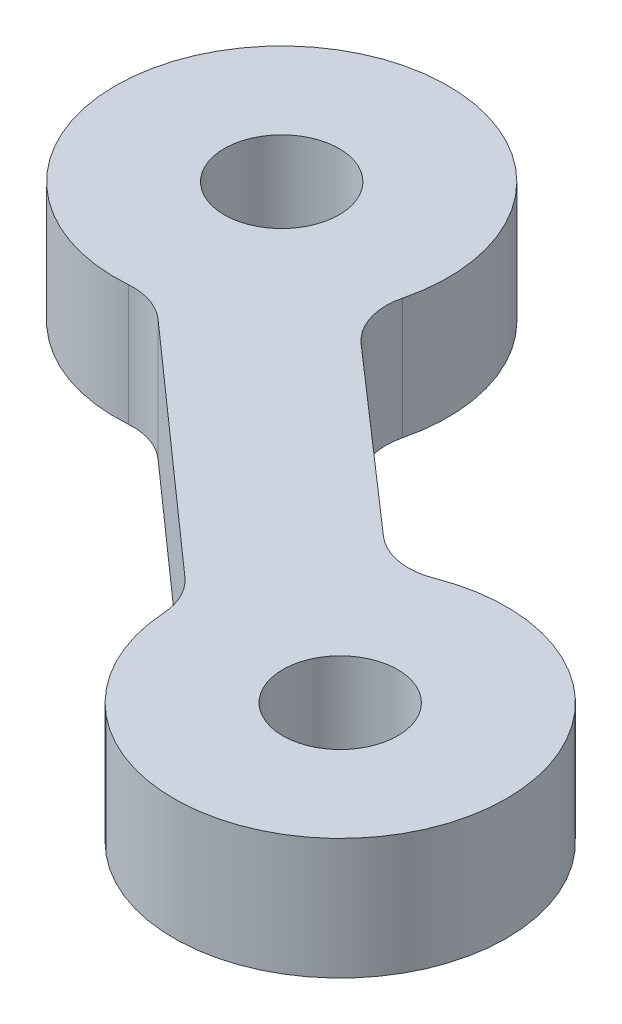
ISO-10303-21;
HEADER;
FILE_DESCRIPTION(('STEP AP214'),'2;1');
FILE_NAME('part.step','',(''),(''),'','','');
FILE_SCHEMA(('AUTOMOTIVE_DESIGN { 1 0 10303 214 1 1 1 1 }'));
ENDSEC;
DATA;
#1=APPLICATION_CONTEXT('core data for automotive mechanical design processes');
#2=APPLICATION_PROTOCOL_DEFINITION('international standard','automotive_design',2000,#1);
#3=PRODUCT_CONTEXT('',#1,'mechanical');
#4=PRODUCT('Part','Part','',(#3));
#5=PRODUCT_RELATED_PRODUCT_CATEGORY('part','',(#4));
#6=PRODUCT_DEFINITION_FORMATION('','',#4);
#7=PRODUCT_DEFINITION_CONTEXT('part definition',#1,'design');
#8=PRODUCT_DEFINITION('design','',#6,#7);
#9=PRODUCT_DEFINITION_SHAPE('','',#8);
#10=(LENGTH_UNIT() NAMED_UNIT(*) SI_UNIT(.MILLI.,.METRE.));
#11=(NAMED_UNIT(*) PLANE_ANGLE_UNIT() SI_UNIT($,.RADIAN.));
#12=(NAMED_UNIT(*) SI_UNIT($,.STERADIAN.) SOLID_ANGLE_UNIT());
#13=UNCERTAINTY_MEASURE_WITH_UNIT(LENGTH_MEASURE(1.E-05),#10,'distance_accuracy_value','');
#14=(GEOMETRIC_REPRESENTATION_CONTEXT(3) GLOBAL_UNCERTAINTY_ASSIGNED_CONTEXT((#13)) GLOBAL_UNIT_ASSIGNED_CONTEXT((#10,
#11,#12)) REPRESENTATION_CONTEXT('',''));
#15=CARTESIAN_POINT('',(0.,0.,0.));
#16=DIRECTION('',(0.,0.,1.));
#17=DIRECTION('',(1.,0.,0.));
#18=AXIS2_PLACEMENT_3D('',#15,#16,#17);
#19=CARTESIAN_POINT('',(57.5957148987973,4.,-64.957573194132));
#20=DIRECTION('',(-0.66343448312114,0.,0.748234379459929));
#21=DIRECTION('',(0.748234379459929,0.,0.66343448312114));
#22=AXIS2_PLACEMENT_3D('',#19,#20,#21);
#23=PLANE('',#22);
#24=DIRECTION('',(-0.748234379459929,0.,-0.66343448312114));
#25=VECTOR('',#24,1.);
#26=CARTESIAN_POINT('',(57.5957148987973,4.,-64.957573194132));
#27=LINE('',#26,#25);
#28=CARTESIAN_POINT('',(91.8288464106831,4.,-34.6041965869265));
#29=VERTEX_POINT('',#28);
#30=CARTESIAN_POINT('',(83.9878087778209,4.,-41.5565832880643));
#31=VERTEX_POINT('',#30);
#32=EDGE_CURVE('E168',#29,#31,#27,.T.);
#33=ORIENTED_EDGE('',*,*,#32,.T.);
#34=DIRECTION('',(0.,-1.,0.));
#35=VECTOR('',#34,1.);
#36=CARTESIAN_POINT('',(83.9878087778209,4.,-41.5565832880643));
#37=LINE('',#36,#35);
#38=CARTESIAN_POINT('',(83.9878087778209,0.,-41.5565832880643));
#39=VERTEX_POINT('',#38);
#40=EDGE_CURVE('E120',#31,#39,#37,.T.);
#41=ORIENTED_EDGE('',*,*,#40,.T.);
#42=DIRECTION('',(-0.748234379459929,0.,-0.66343448312114));
#43=VECTOR('',#42,1.);
#44=CARTESIAN_POINT('',(57.5957148987973,0.,-64.957573194132));
#45=LINE('',#44,#43);
#46=CARTESIAN_POINT('',(91.8288464106831,0.,-34.6041965869265));
#47=VERTEX_POINT('',#46);
#48=EDGE_CURVE('E104',#47,#39,#45,.T.);
#49=ORIENTED_EDGE('',*,*,#48,.F.);
#50=DIRECTION('',(0.,-1.,0.));
#51=VECTOR('',#50,1.);
#52=CARTESIAN_POINT('',(91.828846410683,4.,-34.6041965869265));
#53=LINE('',#52,#51);
#54=EDGE_CURVE('E117',#47,#29,#53,.F.);
#55=ORIENTED_EDGE('',*,*,#54,.T.);
#56=EDGE_LOOP('',(#33,#41,#49,#55));
#57=FACE_BOUND('',#56,.T.);
#58=ADVANCED_FACE('F36',(#57),#23,.T.);
#59=CARTESIAN_POINT('',(97.9868806190565,4.,-33.5833584269257));
#60=DIRECTION('',(0.,-1.,0.));
#61=DIRECTION('',(0.,0.,-1.));
#62=AXIS2_PLACEMENT_3D('',#59,#60,#61);
#63=CYLINDRICAL_SURFACE('',#62,5.5);
#64=CARTESIAN_POINT('',(97.9868806190565,4.,-33.5833584269257));
#65=DIRECTION('',(0.,1.,0.));
#66=DIRECTION('',(0.,0.,1.));
#67=AXIS2_PLACEMENT_3D('',#64,#65,#66);
#68=CIRCLE('',#67,5.5);
#69=CARTESIAN_POINT('',(92.4979516243383,4.,-33.2345626543851));
#70=VERTEX_POINT('',#69);
#71=CARTESIAN_POINT('',(95.9828217037036,4.,-38.7052475182468));
#72=VERTEX_POINT('',#71);
#73=EDGE_CURVE('E166',#70,#72,#68,.T.);
#74=ORIENTED_EDGE('',*,*,#73,.F.);
#75=DIRECTION('',(0.,-1.,0.));
#76=VECTOR('',#75,1.);
#77=CARTESIAN_POINT('',(92.4979516243383,4.,-33.2345626543851));
#78=LINE('',#77,#76);
#79=CARTESIAN_POINT('',(92.4979516243383,0.,-33.2345626543851));
#80=VERTEX_POINT('',#79);
#81=EDGE_CURVE('E142',#70,#80,#78,.T.);
#82=ORIENTED_EDGE('',*,*,#81,.T.);
#83=CARTESIAN_POINT('',(97.9868806190565,0.,-33.5833584269257));
#84=DIRECTION('',(0.,1.,0.));
#85=DIRECTION('',(0.,0.,1.));
#86=AXIS2_PLACEMENT_3D('',#83,#84,#85);
#87=CIRCLE('',#86,5.5);
#88=CARTESIAN_POINT('',(95.9828217037036,0.,-38.7052475182468));
#89=VERTEX_POINT('',#88);
#90=EDGE_CURVE('E106',#80,#89,#87,.T.);
#91=ORIENTED_EDGE('',*,*,#90,.T.);
#92=DIRECTION('',(0.,-1.,0.));
#93=VECTOR('',#92,1.);
#94=CARTESIAN_POINT('',(95.9828217037036,4.,-38.7052475182468));
#95=LINE('',#94,#93);
#96=EDGE_CURVE('E140',#89,#72,#95,.F.);
#97=ORIENTED_EDGE('',*,*,#96,.T.);
#98=EDGE_LOOP('',(#74,#82,#91,#97));
#99=FACE_BOUND('',#98,.T.);
#100=ADVANCED_FACE('F162',(#99),#63,.T.);
#101=CARTESIAN_POINT('',(60.0649297277624,4.,-68.6841124689655));
#102=DIRECTION('',(-0.658295591456619,0.,0.752759532831555));
#103=DIRECTION('',(0.752759532831555,0.,0.658295591456619));
#104=AXIS2_PLACEMENT_3D('',#101,#102,#103);
#105=PLANE('',#104);
#106=DIRECTION('',(-0.752759532831555,0.,-0.658295591456619));
#107=VECTOR('',#106,1.);
#108=CARTESIAN_POINT('',(60.0649297277624,0.,-68.6841124689655));
#109=LINE('',#108,#107);
#110=CARTESIAN_POINT('',(93.9374818242984,0.,-39.0622335767005));
#111=VERTEX_POINT('',#110);
#112=CARTESIAN_POINT('',(88.0534392912902,0.,-44.2078864585077));
#113=VERTEX_POINT('',#112);
#114=EDGE_CURVE('E156',#111,#113,#109,.T.);
#115=ORIENTED_EDGE('',*,*,#114,.T.);
#116=DIRECTION('',(0.,1.,0.));
#117=VECTOR('',#116,1.);
#118=CARTESIAN_POINT('',(88.0534392912902,4.,-44.2078864585077));
#119=LINE('',#118,#117);
#120=CARTESIAN_POINT('',(88.0534392912902,4.,-44.2078864585077));
#121=VERTEX_POINT('',#120);
#122=EDGE_CURVE('E51',#113,#121,#119,.T.);
#123=ORIENTED_EDGE('',*,*,#122,.T.);
#124=DIRECTION('',(-0.752759532831555,0.,-0.658295591456619));
#125=VECTOR('',#124,1.);
#126=CARTESIAN_POINT('',(60.0649297277624,4.,-68.6841124689655));
#127=LINE('',#126,#125);
#128=CARTESIAN_POINT('',(93.9374818242984,4.,-39.0622335767005));
#129=VERTEX_POINT('',#128);
#130=EDGE_CURVE('E130',#129,#121,#127,.T.);
#131=ORIENTED_EDGE('',*,*,#130,.F.);
#132=DIRECTION('',(0.,1.,0.));
#133=VECTOR('',#132,1.);
#134=CARTESIAN_POINT('',(93.9374818242984,0.,-39.0622335767005));
#135=LINE('',#134,#133);
#136=EDGE_CURVE('E144',#129,#111,#135,.F.);
#137=ORIENTED_EDGE('',*,*,#136,.T.);
#138=EDGE_LOOP('',(#115,#123,#131,#137));
#139=FACE_BOUND('',#138,.T.);
#140=ADVANCED_FACE('F164',(#139),#105,.F.);
#141=CARTESIAN_POINT('',(82.0955523148534,4.,-47.5387732978373));
#142=DIRECTION('',(0.,-1.,0.));
#143=DIRECTION('',(0.,0.,-1.));
#144=AXIS2_PLACEMENT_3D('',#141,#142,#143);
#145=CYLINDRICAL_SURFACE('',#144,1.9);
#146=CARTESIAN_POINT('',(82.0955523148534,4.,-47.5387732978373));
#147=DIRECTION('',(0.,1.,0.));
#148=DIRECTION('',(0.,0.,1.));
#149=AXIS2_PLACEMENT_3D('',#146,#147,#148);
#150=CIRCLE('',#149,1.9);
#151=CARTESIAN_POINT('',(82.0955523148534,4.,-45.6387732978373));
#152=VERTEX_POINT('',#151);
#153=EDGE_CURVE('E182',#152,#152,#150,.T.);
#154=ORIENTED_EDGE('',*,*,#153,.T.);
#155=EDGE_LOOP('',(#154));
#156=FACE_BOUND('',#155,.T.);
#157=CARTESIAN_POINT('',(82.0955523148534,0.,-47.5387732978373));
#158=DIRECTION('',(0.,1.,0.));
#159=DIRECTION('',(0.,0.,1.));
#160=AXIS2_PLACEMENT_3D('',#157,#158,#159);
#161=CIRCLE('',#160,1.9);
#162=CARTESIAN_POINT('',(82.0955523148534,0.,-45.6387732978373));
#163=VERTEX_POINT('',#162);
#164=EDGE_CURVE('E121',#163,#163,#161,.T.);
#165=ORIENTED_EDGE('',*,*,#164,.F.);
#166=EDGE_LOOP('',(#165));
#167=FACE_BOUND('',#166,.T.);
#168=ADVANCED_FACE('F217',(#156,#167),#145,.F.);
#169=CARTESIAN_POINT('',(97.9868806190565,4.,-33.5833584269257));
#170=DIRECTION('',(0.,-1.,0.));
#171=DIRECTION('',(0.,0.,-1.));
#172=AXIS2_PLACEMENT_3D('',#169,#170,#171);
#173=CYLINDRICAL_SURFACE('',#172,1.9);
#174=CARTESIAN_POINT('',(97.9868806190565,4.,-33.5833584269257));
#175=DIRECTION('',(0.,1.,0.));
#176=DIRECTION('',(0.,0.,1.));
#177=AXIS2_PLACEMENT_3D('',#174,#175,#176);
#178=CIRCLE('',#177,1.9);
#179=CARTESIAN_POINT('',(97.9868806190565,4.,-31.6833584269257));
#180=VERTEX_POINT('',#179);
#181=EDGE_CURVE('E177',#180,#180,#178,.T.);
#182=ORIENTED_EDGE('',*,*,#181,.T.);
#183=EDGE_LOOP('',(#182));
#184=FACE_BOUND('',#183,.T.);
#185=CARTESIAN_POINT('',(97.9868806190565,0.,-33.5833584269257));
#186=DIRECTION('',(0.,1.,0.));
#187=DIRECTION('',(0.,0.,1.));
#188=AXIS2_PLACEMENT_3D('',#185,#186,#187);
#189=CIRCLE('',#188,1.9);
#190=CARTESIAN_POINT('',(97.9868806190565,0.,-31.6833584269257));
#191=VERTEX_POINT('',#190);
#192=EDGE_CURVE('E172',#191,#191,#189,.T.);
#193=ORIENTED_EDGE('',*,*,#192,.F.);
#194=EDGE_LOOP('',(#193));
#195=FACE_BOUND('',#194,.T.);
#196=ADVANCED_FACE('F206',(#184,#195),#173,.F.);
#197=CARTESIAN_POINT('',(82.0955523148534,4.,-47.5387732978373));
#198=DIRECTION('',(0.,-1.,0.));
#199=DIRECTION('',(0.,0.,-1.));
#200=AXIS2_PLACEMENT_3D('',#197,#198,#199);
#201=CYLINDRICAL_SURFACE('',#200,5.50000000000001);
#202=CARTESIAN_POINT('',(82.0955523148534,0.,-47.5387732978373));
#203=DIRECTION('',(0.,1.,0.));
#204=DIRECTION('',(0.,0.,1.));
#205=AXIS2_PLACEMENT_3D('',#202,#203,#204);
#206=CIRCLE('',#205,5.50000000000001);
#207=CARTESIAN_POINT('',(87.4301696317101,0.,-46.2001702638152));
#208=VERTEX_POINT('',#207);
#209=CARTESIAN_POINT('',(82.5101698124519,0.,-42.0544235341292));
#210=VERTEX_POINT('',#209);
#211=EDGE_CURVE('E133',#208,#210,#206,.T.);
#212=ORIENTED_EDGE('',*,*,#211,.T.);
#213=DIRECTION('',(0.,-1.,0.));
#214=VECTOR('',#213,1.);
#215=CARTESIAN_POINT('',(82.5101698124519,4.,-42.0544235341292));
#216=LINE('',#215,#214);
#217=CARTESIAN_POINT('',(82.5101698124519,4.,-42.0544235341292));
#218=VERTEX_POINT('',#217);
#219=EDGE_CURVE('E138',#210,#218,#216,.F.);
#220=ORIENTED_EDGE('',*,*,#219,.T.);
#221=CARTESIAN_POINT('',(82.0955523148534,4.,-47.5387732978373));
#222=DIRECTION('',(0.,1.,0.));
#223=DIRECTION('',(0.,0.,1.));
#224=AXIS2_PLACEMENT_3D('',#221,#222,#223);
#225=CIRCLE('',#224,5.50000000000001);
#226=CARTESIAN_POINT('',(87.4301696317101,4.,-46.2001702638152));
#227=VERTEX_POINT('',#226);
#228=EDGE_CURVE('E125',#227,#218,#225,.T.);
#229=ORIENTED_EDGE('',*,*,#228,.F.);
#230=DIRECTION('',(0.,-1.,0.));
#231=VECTOR('',#230,1.);
#232=CARTESIAN_POINT('',(87.4301696317101,4.,-46.2001702638152));
#233=LINE('',#232,#231);
#234=EDGE_CURVE('E127',#227,#208,#233,.T.);
#235=ORIENTED_EDGE('',*,*,#234,.T.);
#236=EDGE_LOOP('',(#212,#220,#229,#235));
#237=FACE_BOUND('',#236,.T.);
#238=ADVANCED_FACE('F195',(#237),#201,.T.);
#239=CARTESIAN_POINT('',(0.,4.,0.));
#240=DIRECTION('',(0.,1.,0.));
#241=DIRECTION('',(0.,0.,1.));
#242=AXIS2_PLACEMENT_3D('',#239,#240,#241);
#243=PLANE('',#242);
#244=ORIENTED_EDGE('',*,*,#181,.F.);
#245=EDGE_LOOP('',(#244));
#246=FACE_BOUND('',#245,.T.);
#247=ORIENTED_EDGE('',*,*,#153,.F.);
#248=EDGE_LOOP('',(#247));
#249=FACE_BOUND('',#248,.T.);
#250=ORIENTED_EDGE('',*,*,#32,.F.);
#251=CARTESIAN_POINT('',(90.5019774444408,4.,-33.1077278280066));
#252=DIRECTION('',(0.,1.,0.));
#253=DIRECTION('',(0.,0.,1.));
#254=AXIS2_PLACEMENT_3D('',#251,#252,#253);
#255=CIRCLE('',#254,2.);
#256=EDGE_CURVE('E111',#29,#70,#255,.F.);
#257=ORIENTED_EDGE('',*,*,#256,.T.);
#258=ORIENTED_EDGE('',*,*,#73,.T.);
#259=CARTESIAN_POINT('',(95.2540730072116,4.,-40.5677526423636));
#260=DIRECTION('',(0.,1.,0.));
#261=DIRECTION('',(0.,0.,1.));
#262=AXIS2_PLACEMENT_3D('',#259,#260,#261);
#263=CIRCLE('',#262,2.);
#264=EDGE_CURVE('E11',#72,#129,#263,.F.);
#265=ORIENTED_EDGE('',*,*,#264,.T.);
#266=ORIENTED_EDGE('',*,*,#130,.T.);
#267=CARTESIAN_POINT('',(89.3700304742034,4.,-45.7134055241708));
#268=DIRECTION('',(0.,1.,0.));
#269=DIRECTION('',(0.,0.,1.));
#270=AXIS2_PLACEMENT_3D('',#267,#268,#269);
#271=CIRCLE('',#270,2.);
#272=EDGE_CURVE('E154',#121,#227,#271,.F.);
#273=ORIENTED_EDGE('',*,*,#272,.T.);
#274=ORIENTED_EDGE('',*,*,#228,.T.);
#275=CARTESIAN_POINT('',(82.6609398115787,4.,-40.0601145291444));
#276=DIRECTION('',(0.,1.,0.));
#277=DIRECTION('',(0.,0.,1.));
#278=AXIS2_PLACEMENT_3D('',#275,#276,#277);
#279=CIRCLE('',#278,2.);
#280=EDGE_CURVE('E112',#218,#31,#279,.F.);
#281=ORIENTED_EDGE('',*,*,#280,.T.);
#282=EDGE_LOOP('',(#250,#257,#258,#265,#266,#273,#274,#281));
#283=FACE_BOUND('',#282,.T.);
#284=ADVANCED_FACE('F196',(#246,#249,#283),#243,.T.);
#285=CARTESIAN_POINT('',(0.,0.,0.));
#286=DIRECTION('',(0.,1.,0.));
#287=DIRECTION('',(0.,0.,1.));
#288=AXIS2_PLACEMENT_3D('',#285,#286,#287);
#289=PLANE('',#288);
#290=ORIENTED_EDGE('',*,*,#192,.T.);
#291=EDGE_LOOP('',(#290));
#292=FACE_BOUND('',#291,.T.);
#293=ORIENTED_EDGE('',*,*,#164,.T.);
#294=EDGE_LOOP('',(#293));
#295=FACE_BOUND('',#294,.T.);
#296=ORIENTED_EDGE('',*,*,#90,.F.);
#297=CARTESIAN_POINT('',(90.5019774444408,0.,-33.1077278280066));
#298=DIRECTION('',(0.,1.,0.));
#299=DIRECTION('',(0.,0.,1.));
#300=AXIS2_PLACEMENT_3D('',#297,#298,#299);
#301=CIRCLE('',#300,2.);
#302=EDGE_CURVE('E101',#80,#47,#301,.T.);
#303=ORIENTED_EDGE('',*,*,#302,.T.);
#304=ORIENTED_EDGE('',*,*,#48,.T.);
#305=CARTESIAN_POINT('',(82.6609398115787,0.,-40.0601145291444));
#306=DIRECTION('',(0.,1.,0.));
#307=DIRECTION('',(0.,0.,1.));
#308=AXIS2_PLACEMENT_3D('',#305,#306,#307);
#309=CIRCLE('',#308,2.);
#310=EDGE_CURVE('E148',#39,#210,#309,.T.);
#311=ORIENTED_EDGE('',*,*,#310,.T.);
#312=ORIENTED_EDGE('',*,*,#211,.F.);
#313=CARTESIAN_POINT('',(89.3700304742034,0.,-45.7134055241708));
#314=DIRECTION('',(0.,1.,0.));
#315=DIRECTION('',(0.,0.,1.));
#316=AXIS2_PLACEMENT_3D('',#313,#314,#315);
#317=CIRCLE('',#316,2.);
#318=EDGE_CURVE('E152',#208,#113,#317,.T.);
#319=ORIENTED_EDGE('',*,*,#318,.T.);
#320=ORIENTED_EDGE('',*,*,#114,.F.);
#321=CARTESIAN_POINT('',(95.2540730072116,0.,-40.5677526423636));
#322=DIRECTION('',(0.,1.,0.));
#323=DIRECTION('',(0.,0.,1.));
#324=AXIS2_PLACEMENT_3D('',#321,#322,#323);
#325=CIRCLE('',#324,2.);
#326=EDGE_CURVE('E44',#111,#89,#325,.T.);
#327=ORIENTED_EDGE('',*,*,#326,.T.);
#328=EDGE_LOOP('',(#296,#303,#304,#311,#312,#319,#320,#327));
#329=FACE_BOUND('',#328,.T.);
#330=ADVANCED_FACE('F103',(#292,#295,#329),#289,.F.);
#331=CARTESIAN_POINT('',(82.6609398115787,4.,-40.0601145291444));
#332=DIRECTION('',(0.,-1.,0.));
#333=DIRECTION('',(0.,0.,-1.));
#334=AXIS2_PLACEMENT_3D('',#331,#332,#333);
#335=CYLINDRICAL_SURFACE('',#334,2.);
#336=ORIENTED_EDGE('',*,*,#280,.F.);
#337=ORIENTED_EDGE('',*,*,#219,.F.);
#338=ORIENTED_EDGE('',*,*,#310,.F.);
#339=ORIENTED_EDGE('',*,*,#40,.F.);
#340=EDGE_LOOP('',(#336,#337,#338,#339));
#341=FACE_BOUND('',#340,.T.);
#342=ADVANCED_FACE('F190',(#341),#335,.F.);
#343=CARTESIAN_POINT('',(90.5019774444408,4.,-33.1077278280066));
#344=DIRECTION('',(0.,-1.,0.));
#345=DIRECTION('',(0.,0.,-1.));
#346=AXIS2_PLACEMENT_3D('',#343,#344,#345);
#347=CYLINDRICAL_SURFACE('',#346,2.);
#348=ORIENTED_EDGE('',*,*,#256,.F.);
#349=ORIENTED_EDGE('',*,*,#54,.F.);
#350=ORIENTED_EDGE('',*,*,#302,.F.);
#351=ORIENTED_EDGE('',*,*,#81,.F.);
#352=EDGE_LOOP('',(#348,#349,#350,#351));
#353=FACE_BOUND('',#352,.T.);
#354=ADVANCED_FACE('F124',(#353),#347,.F.);
#355=CARTESIAN_POINT('',(89.3700304742034,4.,-45.7134055241708));
#356=DIRECTION('',(0.,-1.,0.));
#357=DIRECTION('',(0.,0.,-1.));
#358=AXIS2_PLACEMENT_3D('',#355,#356,#357);
#359=CYLINDRICAL_SURFACE('',#358,2.);
#360=ORIENTED_EDGE('',*,*,#272,.F.);
#361=ORIENTED_EDGE('',*,*,#122,.F.);
#362=ORIENTED_EDGE('',*,*,#318,.F.);
#363=ORIENTED_EDGE('',*,*,#234,.F.);
#364=EDGE_LOOP('',(#360,#361,#362,#363));
#365=FACE_BOUND('',#364,.T.);
#366=ADVANCED_FACE('F193',(#365),#359,.F.);
#367=CARTESIAN_POINT('',(95.2540730072116,4.,-40.5677526423636));
#368=DIRECTION('',(0.,-1.,0.));
#369=DIRECTION('',(0.,0.,-1.));
#370=AXIS2_PLACEMENT_3D('',#367,#368,#369);
#371=CYLINDRICAL_SURFACE('',#370,2.);
#372=ORIENTED_EDGE('',*,*,#264,.F.);
#373=ORIENTED_EDGE('',*,*,#96,.F.);
#374=ORIENTED_EDGE('',*,*,#326,.F.);
#375=ORIENTED_EDGE('',*,*,#136,.F.);
#376=EDGE_LOOP('',(#372,#373,#374,#375));
#377=FACE_BOUND('',#376,.T.);
#378=ADVANCED_FACE('F38',(#377),#371,.F.);
#379=CLOSED_SHELL('',(#58,#100,#140,#168,#196,#238,#284,#330,#342,#354,#366,#378));
#380=MANIFOLD_SOLID_BREP('B2',#379);
#381=ADVANCED_BREP_SHAPE_REPRESENTATION('',(#18,#380),#14);
#382=SHAPE_DEFINITION_REPRESENTATION(#9,#381);
ENDSEC;
END-ISO-10303-21;
